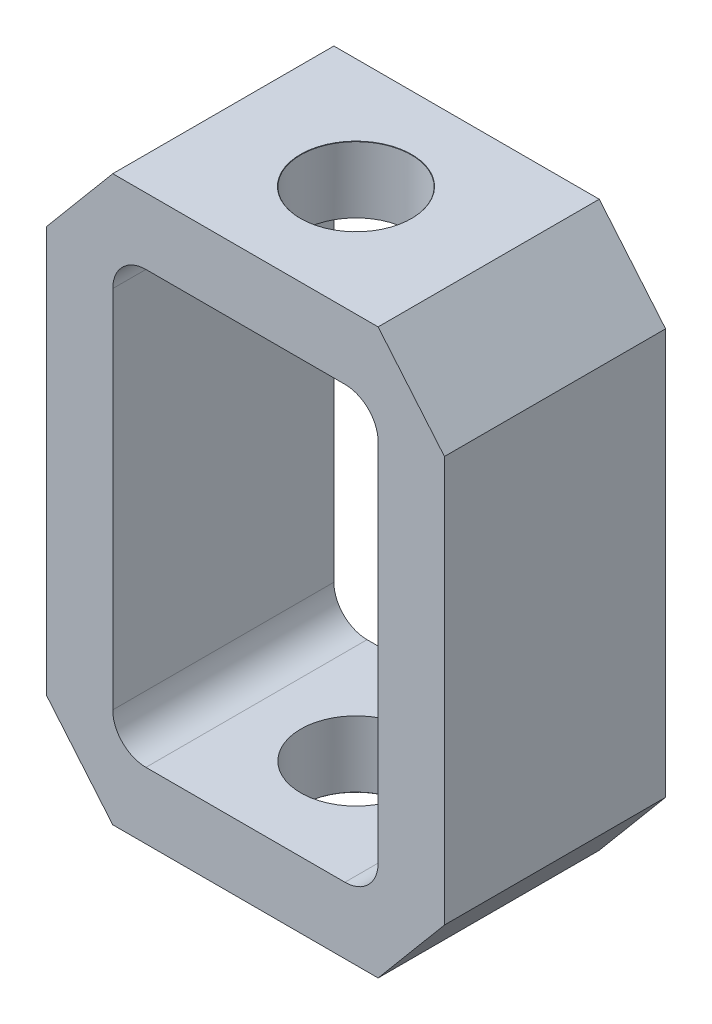
ISO-10303-21;
HEADER;
FILE_DESCRIPTION(('STEP AP214'),'2;1');
FILE_NAME('part.step','',(''),(''),'','','');
FILE_SCHEMA(('AUTOMOTIVE_DESIGN { 1 0 10303 214 1 1 1 1 }'));
ENDSEC;
DATA;
#1=APPLICATION_CONTEXT('core data for automotive mechanical design processes');
#2=APPLICATION_PROTOCOL_DEFINITION('international standard','automotive_design',2000,#1);
#3=PRODUCT_CONTEXT('',#1,'mechanical');
#4=PRODUCT('Part','Part','',(#3));
#5=PRODUCT_RELATED_PRODUCT_CATEGORY('part','',(#4));
#6=PRODUCT_DEFINITION_FORMATION('','',#4);
#7=PRODUCT_DEFINITION_CONTEXT('part definition',#1,'design');
#8=PRODUCT_DEFINITION('design','',#6,#7);
#9=PRODUCT_DEFINITION_SHAPE('','',#8);
#10=(LENGTH_UNIT() NAMED_UNIT(*) SI_UNIT(.MILLI.,.METRE.));
#11=(NAMED_UNIT(*) PLANE_ANGLE_UNIT() SI_UNIT($,.RADIAN.));
#12=(NAMED_UNIT(*) SI_UNIT($,.STERADIAN.) SOLID_ANGLE_UNIT());
#13=UNCERTAINTY_MEASURE_WITH_UNIT(LENGTH_MEASURE(1.E-05),#10,'distance_accuracy_value','');
#14=(GEOMETRIC_REPRESENTATION_CONTEXT(3) GLOBAL_UNCERTAINTY_ASSIGNED_CONTEXT((#13)) GLOBAL_UNIT_ASSIGNED_CONTEXT((#10,
#11,#12)) REPRESENTATION_CONTEXT('',''));
#15=CARTESIAN_POINT('',(0.,0.,0.));
#16=DIRECTION('',(0.,0.,1.));
#17=DIRECTION('',(1.,0.,0.));
#18=AXIS2_PLACEMENT_3D('',#15,#16,#17);
#19=CARTESIAN_POINT('',(-18.,0.,10.));
#20=DIRECTION('',(-1.,0.,0.));
#21=DIRECTION('',(0.,-1.,0.));
#22=AXIS2_PLACEMENT_3D('',#19,#20,#21);
#23=PLANE('',#22);
#24=DIRECTION('',(0.,1.,0.));
#25=VECTOR('',#24,1.);
#26=CARTESIAN_POINT('',(-18.,0.,-10.));
#27=LINE('',#26,#25);
#28=CARTESIAN_POINT('',(-18.,-18.3494784444348,-10.));
#29=VERTEX_POINT('',#28);
#30=CARTESIAN_POINT('',(-18.,18.3494784444348,-10.));
#31=VERTEX_POINT('',#30);
#32=EDGE_CURVE('E162',#29,#31,#27,.T.);
#33=ORIENTED_EDGE('',*,*,#32,.F.);
#34=DIRECTION('',(0.,0.,-1.));
#35=VECTOR('',#34,1.);
#36=CARTESIAN_POINT('',(-18.,-18.3494784444348,10.));
#37=LINE('',#36,#35);
#38=CARTESIAN_POINT('',(-18.,-18.3494784444348,10.));
#39=VERTEX_POINT('',#38);
#40=EDGE_CURVE('E156',#39,#29,#37,.T.);
#41=ORIENTED_EDGE('',*,*,#40,.F.);
#42=DIRECTION('',(0.,1.,0.));
#43=VECTOR('',#42,1.);
#44=CARTESIAN_POINT('',(-18.,0.,10.));
#45=LINE('',#44,#43);
#46=CARTESIAN_POINT('',(-18.,18.3494784444348,10.));
#47=VERTEX_POINT('',#46);
#48=EDGE_CURVE('E159',#39,#47,#45,.T.);
#49=ORIENTED_EDGE('',*,*,#48,.T.);
#50=DIRECTION('',(0.,0.,-1.));
#51=VECTOR('',#50,1.);
#52=CARTESIAN_POINT('',(-18.,18.3494784444348,10.));
#53=LINE('',#52,#51);
#54=EDGE_CURVE('E211',#47,#31,#53,.T.);
#55=ORIENTED_EDGE('',*,*,#54,.T.);
#56=EDGE_LOOP('',(#33,#41,#49,#55));
#57=FACE_BOUND('',#56,.T.);
#58=ADVANCED_FACE('F41',(#57),#23,.T.);
#59=CARTESIAN_POINT('',(-19.5981879169072,-16.4448322528199,10.));
#60=DIRECTION('',(0.766044443118977,0.642787609686541,0.));
#61=DIRECTION('',(-0.642787609686541,0.766044443118977,0.));
#62=AXIS2_PLACEMENT_3D('',#59,#60,#61);
#63=PLANE('',#62);
#64=DIRECTION('',(0.642787609686541,-0.766044443118977,0.));
#65=VECTOR('',#64,1.);
#66=CARTESIAN_POINT('',(-19.5981879169072,-16.4448322528199,-10.));
#67=LINE('',#66,#65);
#68=CARTESIAN_POINT('',(-12.,-25.5,-10.));
#69=VERTEX_POINT('',#68);
#70=EDGE_CURVE('E230',#29,#69,#67,.T.);
#71=ORIENTED_EDGE('',*,*,#70,.T.);
#72=DIRECTION('',(0.,0.,-1.));
#73=VECTOR('',#72,1.);
#74=CARTESIAN_POINT('',(-12.,-25.5,10.));
#75=LINE('',#74,#73);
#76=CARTESIAN_POINT('',(-12.,-25.5,10.));
#77=VERTEX_POINT('',#76);
#78=EDGE_CURVE('E168',#77,#69,#75,.T.);
#79=ORIENTED_EDGE('',*,*,#78,.F.);
#80=DIRECTION('',(0.642787609686541,-0.766044443118977,0.));
#81=VECTOR('',#80,1.);
#82=CARTESIAN_POINT('',(-19.5981879169072,-16.4448322528199,10.));
#83=LINE('',#82,#81);
#84=EDGE_CURVE('E172',#39,#77,#83,.T.);
#85=ORIENTED_EDGE('',*,*,#84,.F.);
#86=ORIENTED_EDGE('',*,*,#40,.T.);
#87=EDGE_LOOP('',(#71,#79,#85,#86));
#88=FACE_BOUND('',#87,.T.);
#89=ADVANCED_FACE('F173',(#88),#63,.F.);
#90=CARTESIAN_POINT('',(0.,-25.5,10.));
#91=DIRECTION('',(0.,1.,0.));
#92=DIRECTION('',(-1.,0.,0.));
#93=AXIS2_PLACEMENT_3D('',#90,#91,#92);
#94=PLANE('',#93);
#95=CARTESIAN_POINT('',(0.,-25.5,0.));
#96=DIRECTION('',(0.,-1.,0.));
#97=DIRECTION('',(0.,0.,-1.));
#98=AXIS2_PLACEMENT_3D('',#95,#96,#97);
#99=CIRCLE('',#98,5.025);
#100=CARTESIAN_POINT('',(0.,-25.5,-5.025));
#101=VERTEX_POINT('',#100);
#102=EDGE_CURVE('E373',#101,#101,#99,.T.);
#103=ORIENTED_EDGE('',*,*,#102,.F.);
#104=EDGE_LOOP('',(#103));
#105=FACE_BOUND('',#104,.T.);
#106=DIRECTION('',(1.,0.,0.));
#107=VECTOR('',#106,1.);
#108=CARTESIAN_POINT('',(0.,-25.5,-10.));
#109=LINE('',#108,#107);
#110=CARTESIAN_POINT('',(12.,-25.5,-10.));
#111=VERTEX_POINT('',#110);
#112=EDGE_CURVE('E233',#69,#111,#109,.T.);
#113=ORIENTED_EDGE('',*,*,#112,.T.);
#114=DIRECTION('',(0.,0.,-1.));
#115=VECTOR('',#114,1.);
#116=CARTESIAN_POINT('',(12.,-25.5,10.));
#117=LINE('',#116,#115);
#118=CARTESIAN_POINT('',(12.,-25.5,10.));
#119=VERTEX_POINT('',#118);
#120=EDGE_CURVE('E273',#119,#111,#117,.T.);
#121=ORIENTED_EDGE('',*,*,#120,.F.);
#122=DIRECTION('',(1.,0.,0.));
#123=VECTOR('',#122,1.);
#124=CARTESIAN_POINT('',(0.,-25.5,10.));
#125=LINE('',#124,#123);
#126=EDGE_CURVE('E177',#77,#119,#125,.T.);
#127=ORIENTED_EDGE('',*,*,#126,.F.);
#128=ORIENTED_EDGE('',*,*,#78,.T.);
#129=EDGE_LOOP('',(#113,#121,#127,#128));
#130=FACE_BOUND('',#129,.T.);
#131=ADVANCED_FACE('F380',(#105,#130),#94,.F.);
#132=CARTESIAN_POINT('',(19.5981879169072,-16.4448322528199,10.));
#133=DIRECTION('',(0.766044443118977,-0.642787609686541,0.));
#134=DIRECTION('',(0.642787609686541,0.766044443118977,0.));
#135=AXIS2_PLACEMENT_3D('',#132,#133,#134);
#136=PLANE('',#135);
#137=DIRECTION('',(-0.642787609686541,-0.766044443118977,0.));
#138=VECTOR('',#137,1.);
#139=CARTESIAN_POINT('',(19.5981879169072,-16.4448322528199,-10.));
#140=LINE('',#139,#138);
#141=CARTESIAN_POINT('',(18.,-18.3494784444348,-10.));
#142=VERTEX_POINT('',#141);
#143=EDGE_CURVE('E237',#142,#111,#140,.T.);
#144=ORIENTED_EDGE('',*,*,#143,.F.);
#145=DIRECTION('',(0.,0.,-1.));
#146=VECTOR('',#145,1.);
#147=CARTESIAN_POINT('',(18.,-18.3494784444348,10.));
#148=LINE('',#147,#146);
#149=CARTESIAN_POINT('',(18.,-18.3494784444348,10.));
#150=VERTEX_POINT('',#149);
#151=EDGE_CURVE('E270',#150,#142,#148,.T.);
#152=ORIENTED_EDGE('',*,*,#151,.F.);
#153=DIRECTION('',(-0.642787609686541,-0.766044443118977,0.));
#154=VECTOR('',#153,1.);
#155=CARTESIAN_POINT('',(19.5981879169072,-16.4448322528199,10.));
#156=LINE('',#155,#154);
#157=EDGE_CURVE('E194',#150,#119,#156,.T.);
#158=ORIENTED_EDGE('',*,*,#157,.T.);
#159=ORIENTED_EDGE('',*,*,#120,.T.);
#160=EDGE_LOOP('',(#144,#152,#158,#159));
#161=FACE_BOUND('',#160,.T.);
#162=ADVANCED_FACE('F383',(#161),#136,.T.);
#163=CARTESIAN_POINT('',(18.,0.,10.));
#164=DIRECTION('',(-1.,0.,0.));
#165=DIRECTION('',(0.,0.,1.));
#166=AXIS2_PLACEMENT_3D('',#163,#164,#165);
#167=PLANE('',#166);
#168=DIRECTION('',(0.,1.,0.));
#169=VECTOR('',#168,1.);
#170=CARTESIAN_POINT('',(18.,0.,-10.));
#171=LINE('',#170,#169);
#172=CARTESIAN_POINT('',(18.,18.3494784444348,-10.));
#173=VERTEX_POINT('',#172);
#174=EDGE_CURVE('E241',#142,#173,#171,.T.);
#175=ORIENTED_EDGE('',*,*,#174,.T.);
#176=DIRECTION('',(0.,0.,-1.));
#177=VECTOR('',#176,1.);
#178=CARTESIAN_POINT('',(18.,18.3494784444348,10.));
#179=LINE('',#178,#177);
#180=CARTESIAN_POINT('',(18.,18.3494784444348,10.));
#181=VERTEX_POINT('',#180);
#182=EDGE_CURVE('E266',#181,#173,#179,.T.);
#183=ORIENTED_EDGE('',*,*,#182,.F.);
#184=DIRECTION('',(0.,1.,0.));
#185=VECTOR('',#184,1.);
#186=CARTESIAN_POINT('',(18.,0.,10.));
#187=LINE('',#186,#185);
#188=EDGE_CURVE('E198',#150,#181,#187,.T.);
#189=ORIENTED_EDGE('',*,*,#188,.F.);
#190=ORIENTED_EDGE('',*,*,#151,.T.);
#191=EDGE_LOOP('',(#175,#183,#189,#190));
#192=FACE_BOUND('',#191,.T.);
#193=ADVANCED_FACE('F394',(#192),#167,.F.);
#194=CARTESIAN_POINT('',(19.5981879169072,16.4448322528199,10.));
#195=DIRECTION('',(-0.766044443118977,-0.642787609686541,0.));
#196=DIRECTION('',(0.642787609686541,-0.766044443118977,0.));
#197=AXIS2_PLACEMENT_3D('',#194,#195,#196);
#198=PLANE('',#197);
#199=DIRECTION('',(-0.642787609686541,0.766044443118977,0.));
#200=VECTOR('',#199,1.);
#201=CARTESIAN_POINT('',(19.5981879169072,16.4448322528199,-10.));
#202=LINE('',#201,#200);
#203=CARTESIAN_POINT('',(12.,25.5,-10.));
#204=VERTEX_POINT('',#203);
#205=EDGE_CURVE('E245',#173,#204,#202,.T.);
#206=ORIENTED_EDGE('',*,*,#205,.T.);
#207=DIRECTION('',(0.,0.,-1.));
#208=VECTOR('',#207,1.);
#209=CARTESIAN_POINT('',(12.,25.5,10.));
#210=LINE('',#209,#208);
#211=CARTESIAN_POINT('',(12.,25.5,10.));
#212=VERTEX_POINT('',#211);
#213=EDGE_CURVE('E263',#212,#204,#210,.T.);
#214=ORIENTED_EDGE('',*,*,#213,.F.);
#215=DIRECTION('',(-0.642787609686541,0.766044443118977,0.));
#216=VECTOR('',#215,1.);
#217=CARTESIAN_POINT('',(19.5981879169072,16.4448322528199,10.));
#218=LINE('',#217,#216);
#219=EDGE_CURVE('E202',#181,#212,#218,.T.);
#220=ORIENTED_EDGE('',*,*,#219,.F.);
#221=ORIENTED_EDGE('',*,*,#182,.T.);
#222=EDGE_LOOP('',(#206,#214,#220,#221));
#223=FACE_BOUND('',#222,.T.);
#224=ADVANCED_FACE('F396',(#223),#198,.F.);
#225=CARTESIAN_POINT('',(0.,25.5,10.));
#226=DIRECTION('',(0.,1.,0.));
#227=DIRECTION('',(-1.,0.,0.));
#228=AXIS2_PLACEMENT_3D('',#225,#226,#227);
#229=PLANE('',#228);
#230=CARTESIAN_POINT('',(0.,25.5,0.));
#231=DIRECTION('',(0.,1.,0.));
#232=DIRECTION('',(0.,0.,1.));
#233=AXIS2_PLACEMENT_3D('',#230,#231,#232);
#234=CIRCLE('',#233,5.025);
#235=CARTESIAN_POINT('',(0.,25.5,5.025));
#236=VERTEX_POINT('',#235);
#237=EDGE_CURVE('E286',#236,#236,#234,.T.);
#238=ORIENTED_EDGE('',*,*,#237,.F.);
#239=EDGE_LOOP('',(#238));
#240=FACE_BOUND('',#239,.T.);
#241=DIRECTION('',(1.,0.,0.));
#242=VECTOR('',#241,1.);
#243=CARTESIAN_POINT('',(0.,25.5,-10.));
#244=LINE('',#243,#242);
#245=CARTESIAN_POINT('',(-12.,25.5,-10.));
#246=VERTEX_POINT('',#245);
#247=EDGE_CURVE('E249',#246,#204,#244,.T.);
#248=ORIENTED_EDGE('',*,*,#247,.F.);
#249=DIRECTION('',(0.,0.,-1.));
#250=VECTOR('',#249,1.);
#251=CARTESIAN_POINT('',(-12.,25.5,10.));
#252=LINE('',#251,#250);
#253=CARTESIAN_POINT('',(-12.,25.5,10.));
#254=VERTEX_POINT('',#253);
#255=EDGE_CURVE('E260',#254,#246,#252,.T.);
#256=ORIENTED_EDGE('',*,*,#255,.F.);
#257=DIRECTION('',(1.,0.,0.));
#258=VECTOR('',#257,1.);
#259=CARTESIAN_POINT('',(0.,25.5,10.));
#260=LINE('',#259,#258);
#261=EDGE_CURVE('E205',#254,#212,#260,.T.);
#262=ORIENTED_EDGE('',*,*,#261,.T.);
#263=ORIENTED_EDGE('',*,*,#213,.T.);
#264=EDGE_LOOP('',(#248,#256,#262,#263));
#265=FACE_BOUND('',#264,.T.);
#266=ADVANCED_FACE('F399',(#240,#265),#229,.T.);
#267=CARTESIAN_POINT('',(0.,-19.5,10.));
#268=DIRECTION('',(0.,1.,0.));
#269=DIRECTION('',(-1.,0.,0.));
#270=AXIS2_PLACEMENT_3D('',#267,#268,#269);
#271=PLANE('',#270);
#272=CARTESIAN_POINT('',(0.,-19.5,0.));
#273=DIRECTION('',(0.,1.,0.));
#274=DIRECTION('',(-1.,0.,0.));
#275=AXIS2_PLACEMENT_3D('',#272,#273,#274);
#276=CIRCLE('',#275,4.99999999999999);
#277=CARTESIAN_POINT('',(-4.99999999999998,-19.5,0.));
#278=VERTEX_POINT('',#277);
#279=EDGE_CURVE('E282',#278,#278,#276,.T.);
#280=ORIENTED_EDGE('',*,*,#279,.F.);
#281=EDGE_LOOP('',(#280));
#282=FACE_BOUND('',#281,.T.);
#283=DIRECTION('',(1.,0.,0.));
#284=VECTOR('',#283,1.);
#285=CARTESIAN_POINT('',(0.,-19.5,-10.));
#286=LINE('',#285,#284);
#287=CARTESIAN_POINT('',(-9.,-19.5,-10.));
#288=VERTEX_POINT('',#287);
#289=CARTESIAN_POINT('',(9.00000000000001,-19.5,-10.));
#290=VERTEX_POINT('',#289);
#291=EDGE_CURVE('E212',#288,#290,#286,.T.);
#292=ORIENTED_EDGE('',*,*,#291,.F.);
#293=DIRECTION('',(0.,0.,-1.));
#294=VECTOR('',#293,1.);
#295=CARTESIAN_POINT('',(-9.,-19.5,10.));
#296=LINE('',#295,#294);
#297=CARTESIAN_POINT('',(-9.,-19.5,10.));
#298=VERTEX_POINT('',#297);
#299=EDGE_CURVE('E298',#288,#298,#296,.F.);
#300=ORIENTED_EDGE('',*,*,#299,.T.);
#301=DIRECTION('',(1.,0.,0.));
#302=VECTOR('',#301,1.);
#303=CARTESIAN_POINT('',(0.,-19.5,10.));
#304=LINE('',#303,#302);
#305=CARTESIAN_POINT('',(9.00000000000001,-19.5,10.));
#306=VERTEX_POINT('',#305);
#307=EDGE_CURVE('E257',#298,#306,#304,.T.);
#308=ORIENTED_EDGE('',*,*,#307,.T.);
#309=DIRECTION('',(0.,0.,-1.));
#310=VECTOR('',#309,1.);
#311=CARTESIAN_POINT('',(9.00000000000001,-19.5,-10.));
#312=LINE('',#311,#310);
#313=EDGE_CURVE('E294',#306,#290,#312,.T.);
#314=ORIENTED_EDGE('',*,*,#313,.T.);
#315=EDGE_LOOP('',(#292,#300,#308,#314));
#316=FACE_BOUND('',#315,.T.);
#317=ADVANCED_FACE('F355',(#282,#316),#271,.T.);
#318=CARTESIAN_POINT('',(-12.,0.,10.));
#319=DIRECTION('',(-1.,0.,0.));
#320=DIRECTION('',(0.,-1.,0.));
#321=AXIS2_PLACEMENT_3D('',#318,#319,#320);
#322=PLANE('',#321);
#323=DIRECTION('',(0.,1.,0.));
#324=VECTOR('',#323,1.);
#325=CARTESIAN_POINT('',(-12.,0.,10.));
#326=LINE('',#325,#324);
#327=CARTESIAN_POINT('',(-12.,-16.5,10.));
#328=VERTEX_POINT('',#327);
#329=CARTESIAN_POINT('',(-12.,16.5,10.));
#330=VERTEX_POINT('',#329);
#331=EDGE_CURVE('E358',#328,#330,#326,.T.);
#332=ORIENTED_EDGE('',*,*,#331,.F.);
#333=DIRECTION('',(0.,0.,-1.));
#334=VECTOR('',#333,1.);
#335=CARTESIAN_POINT('',(-12.,-16.5,10.));
#336=LINE('',#335,#334);
#337=CARTESIAN_POINT('',(-12.,-16.5,-10.));
#338=VERTEX_POINT('',#337);
#339=EDGE_CURVE('E290',#328,#338,#336,.T.);
#340=ORIENTED_EDGE('',*,*,#339,.T.);
#341=DIRECTION('',(0.,1.,0.));
#342=VECTOR('',#341,1.);
#343=CARTESIAN_POINT('',(-12.,0.,-10.));
#344=LINE('',#343,#342);
#345=CARTESIAN_POINT('',(-12.,16.5,-10.));
#346=VERTEX_POINT('',#345);
#347=EDGE_CURVE('E216',#338,#346,#344,.T.);
#348=ORIENTED_EDGE('',*,*,#347,.T.);
#349=DIRECTION('',(0.,0.,-1.));
#350=VECTOR('',#349,1.);
#351=CARTESIAN_POINT('',(-12.,16.5,10.));
#352=LINE('',#351,#350);
#353=EDGE_CURVE('E167',#346,#330,#352,.F.);
#354=ORIENTED_EDGE('',*,*,#353,.T.);
#355=EDGE_LOOP('',(#332,#340,#348,#354));
#356=FACE_BOUND('',#355,.T.);
#357=ADVANCED_FACE('F422',(#356),#322,.F.);
#358=CARTESIAN_POINT('',(0.,19.5,10.));
#359=DIRECTION('',(0.,1.,0.));
#360=DIRECTION('',(-1.,0.,0.));
#361=AXIS2_PLACEMENT_3D('',#358,#359,#360);
#362=PLANE('',#361);
#363=CARTESIAN_POINT('',(0.,19.5,0.));
#364=DIRECTION('',(0.,1.,0.));
#365=DIRECTION('',(-1.,0.,0.));
#366=AXIS2_PLACEMENT_3D('',#363,#364,#365);
#367=CIRCLE('',#366,4.99999999999999);
#368=CARTESIAN_POINT('',(-4.99999999999999,19.5,0.));
#369=VERTEX_POINT('',#368);
#370=EDGE_CURVE('E217',#369,#369,#367,.T.);
#371=ORIENTED_EDGE('',*,*,#370,.T.);
#372=EDGE_LOOP('',(#371));
#373=FACE_BOUND('',#372,.T.);
#374=DIRECTION('',(1.,0.,0.));
#375=VECTOR('',#374,1.);
#376=CARTESIAN_POINT('',(0.,19.5,10.));
#377=LINE('',#376,#375);
#378=CARTESIAN_POINT('',(-9.00000000000001,19.5,10.));
#379=VERTEX_POINT('',#378);
#380=CARTESIAN_POINT('',(9.00000000000001,19.5,10.));
#381=VERTEX_POINT('',#380);
#382=EDGE_CURVE('E188',#379,#381,#377,.T.);
#383=ORIENTED_EDGE('',*,*,#382,.F.);
#384=DIRECTION('',(0.,0.,-1.));
#385=VECTOR('',#384,1.);
#386=CARTESIAN_POINT('',(-9.00000000000001,19.5,-10.));
#387=LINE('',#386,#385);
#388=CARTESIAN_POINT('',(-9.00000000000001,19.5,-10.));
#389=VERTEX_POINT('',#388);
#390=EDGE_CURVE('E310',#379,#389,#387,.T.);
#391=ORIENTED_EDGE('',*,*,#390,.T.);
#392=DIRECTION('',(1.,0.,0.));
#393=VECTOR('',#392,1.);
#394=CARTESIAN_POINT('',(0.,19.5,-10.));
#395=LINE('',#394,#393);
#396=CARTESIAN_POINT('',(9.00000000000001,19.5,-10.));
#397=VERTEX_POINT('',#396);
#398=EDGE_CURVE('E221',#389,#397,#395,.T.);
#399=ORIENTED_EDGE('',*,*,#398,.T.);
#400=DIRECTION('',(0.,0.,-1.));
#401=VECTOR('',#400,1.);
#402=CARTESIAN_POINT('',(9.00000000000001,19.5,10.));
#403=LINE('',#402,#401);
#404=EDGE_CURVE('E57',#397,#381,#403,.F.);
#405=ORIENTED_EDGE('',*,*,#404,.T.);
#406=EDGE_LOOP('',(#383,#391,#399,#405));
#407=FACE_BOUND('',#406,.T.);
#408=ADVANCED_FACE('F339',(#373,#407),#362,.F.);
#409=CARTESIAN_POINT('',(12.,0.,10.));
#410=DIRECTION('',(-1.,0.,0.));
#411=DIRECTION('',(0.,0.,1.));
#412=AXIS2_PLACEMENT_3D('',#409,#410,#411);
#413=PLANE('',#412);
#414=DIRECTION('',(0.,1.,0.));
#415=VECTOR('',#414,1.);
#416=CARTESIAN_POINT('',(12.,0.,-10.));
#417=LINE('',#416,#415);
#418=CARTESIAN_POINT('',(12.,-16.5,-10.));
#419=VERTEX_POINT('',#418);
#420=CARTESIAN_POINT('',(12.,16.5,-10.));
#421=VERTEX_POINT('',#420);
#422=EDGE_CURVE('E224',#419,#421,#417,.T.);
#423=ORIENTED_EDGE('',*,*,#422,.F.);
#424=DIRECTION('',(0.,0.,-1.));
#425=VECTOR('',#424,1.);
#426=CARTESIAN_POINT('',(12.,-16.5,10.));
#427=LINE('',#426,#425);
#428=CARTESIAN_POINT('',(12.,-16.5,10.));
#429=VERTEX_POINT('',#428);
#430=EDGE_CURVE('E305',#419,#429,#427,.F.);
#431=ORIENTED_EDGE('',*,*,#430,.T.);
#432=DIRECTION('',(0.,1.,0.));
#433=VECTOR('',#432,1.);
#434=CARTESIAN_POINT('',(12.,0.,10.));
#435=LINE('',#434,#433);
#436=CARTESIAN_POINT('',(12.,16.5,10.));
#437=VERTEX_POINT('',#436);
#438=EDGE_CURVE('E184',#429,#437,#435,.T.);
#439=ORIENTED_EDGE('',*,*,#438,.T.);
#440=DIRECTION('',(0.,0.,-1.));
#441=VECTOR('',#440,1.);
#442=CARTESIAN_POINT('',(12.,16.5,10.));
#443=LINE('',#442,#441);
#444=EDGE_CURVE('E301',#437,#421,#443,.T.);
#445=ORIENTED_EDGE('',*,*,#444,.T.);
#446=EDGE_LOOP('',(#423,#431,#439,#445));
#447=FACE_BOUND('',#446,.T.);
#448=ADVANCED_FACE('F346',(#447),#413,.T.);
#449=CARTESIAN_POINT('',(-19.5981879169072,16.4448322528199,10.));
#450=DIRECTION('',(-0.766044443118977,0.642787609686541,0.));
#451=DIRECTION('',(-0.642787609686541,-0.766044443118977,0.));
#452=AXIS2_PLACEMENT_3D('',#449,#450,#451);
#453=PLANE('',#452);
#454=DIRECTION('',(0.642787609686541,0.766044443118977,0.));
#455=VECTOR('',#454,1.);
#456=CARTESIAN_POINT('',(-19.5981879169072,16.4448322528199,-10.));
#457=LINE('',#456,#455);
#458=EDGE_CURVE('E253',#31,#246,#457,.T.);
#459=ORIENTED_EDGE('',*,*,#458,.F.);
#460=ORIENTED_EDGE('',*,*,#54,.F.);
#461=DIRECTION('',(0.642787609686541,0.766044443118977,0.));
#462=VECTOR('',#461,1.);
#463=CARTESIAN_POINT('',(-19.5981879169072,16.4448322528199,10.));
#464=LINE('',#463,#462);
#465=EDGE_CURVE('E182',#47,#254,#464,.T.);
#466=ORIENTED_EDGE('',*,*,#465,.T.);
#467=ORIENTED_EDGE('',*,*,#255,.T.);
#468=EDGE_LOOP('',(#459,#460,#466,#467));
#469=FACE_BOUND('',#468,.T.);
#470=ADVANCED_FACE('F402',(#469),#453,.T.);
#471=CARTESIAN_POINT('',(0.,0.,10.));
#472=DIRECTION('',(0.,0.,1.));
#473=DIRECTION('',(1.,0.,0.));
#474=AXIS2_PLACEMENT_3D('',#471,#472,#473);
#475=PLANE('',#474);
#476=ORIENTED_EDGE('',*,*,#307,.F.);
#477=CARTESIAN_POINT('',(-9.,-16.5,10.));
#478=DIRECTION('',(0.,0.,1.));
#479=DIRECTION('',(1.,0.,0.));
#480=AXIS2_PLACEMENT_3D('',#477,#478,#479);
#481=CIRCLE('',#480,3.);
#482=EDGE_CURVE('E317',#298,#328,#481,.F.);
#483=ORIENTED_EDGE('',*,*,#482,.T.);
#484=ORIENTED_EDGE('',*,*,#331,.T.);
#485=CARTESIAN_POINT('',(-9.00000000000001,16.5,10.));
#486=DIRECTION('',(0.,0.,1.));
#487=DIRECTION('',(1.,0.,0.));
#488=AXIS2_PLACEMENT_3D('',#485,#486,#487);
#489=CIRCLE('',#488,3.);
#490=EDGE_CURVE('E64',#330,#379,#489,.F.);
#491=ORIENTED_EDGE('',*,*,#490,.T.);
#492=ORIENTED_EDGE('',*,*,#382,.T.);
#493=CARTESIAN_POINT('',(9.00000000000001,16.5,10.));
#494=DIRECTION('',(0.,0.,1.));
#495=DIRECTION('',(1.,0.,0.));
#496=AXIS2_PLACEMENT_3D('',#493,#494,#495);
#497=CIRCLE('',#496,3.);
#498=EDGE_CURVE('E11',#381,#437,#497,.F.);
#499=ORIENTED_EDGE('',*,*,#498,.T.);
#500=ORIENTED_EDGE('',*,*,#438,.F.);
#501=CARTESIAN_POINT('',(9.00000000000001,-16.5,10.));
#502=DIRECTION('',(0.,0.,1.));
#503=DIRECTION('',(1.,0.,0.));
#504=AXIS2_PLACEMENT_3D('',#501,#502,#503);
#505=CIRCLE('',#504,3.);
#506=EDGE_CURVE('E323',#429,#306,#505,.F.);
#507=ORIENTED_EDGE('',*,*,#506,.T.);
#508=EDGE_LOOP('',(#476,#483,#484,#491,#492,#499,#500,#507));
#509=FACE_BOUND('',#508,.T.);
#510=ORIENTED_EDGE('',*,*,#48,.F.);
#511=ORIENTED_EDGE('',*,*,#84,.T.);
#512=ORIENTED_EDGE('',*,*,#126,.T.);
#513=ORIENTED_EDGE('',*,*,#157,.F.);
#514=ORIENTED_EDGE('',*,*,#188,.T.);
#515=ORIENTED_EDGE('',*,*,#219,.T.);
#516=ORIENTED_EDGE('',*,*,#261,.F.);
#517=ORIENTED_EDGE('',*,*,#465,.F.);
#518=EDGE_LOOP('',(#510,#511,#512,#513,#514,#515,#516,#517));
#519=FACE_BOUND('',#518,.T.);
#520=ADVANCED_FACE('F179',(#509,#519),#475,.T.);
#521=CARTESIAN_POINT('',(0.,0.,-10.));
#522=DIRECTION('',(0.,0.,1.));
#523=DIRECTION('',(1.,0.,0.));
#524=AXIS2_PLACEMENT_3D('',#521,#522,#523);
#525=PLANE('',#524);
#526=ORIENTED_EDGE('',*,*,#347,.F.);
#527=CARTESIAN_POINT('',(-9.,-16.5,-10.));
#528=DIRECTION('',(0.,0.,1.));
#529=DIRECTION('',(1.,0.,0.));
#530=AXIS2_PLACEMENT_3D('',#527,#528,#529);
#531=CIRCLE('',#530,3.);
#532=EDGE_CURVE('E314',#338,#288,#531,.T.);
#533=ORIENTED_EDGE('',*,*,#532,.T.);
#534=ORIENTED_EDGE('',*,*,#291,.T.);
#535=CARTESIAN_POINT('',(9.00000000000001,-16.5,-10.));
#536=DIRECTION('',(0.,0.,1.));
#537=DIRECTION('',(1.,0.,0.));
#538=AXIS2_PLACEMENT_3D('',#535,#536,#537);
#539=CIRCLE('',#538,3.);
#540=EDGE_CURVE('E320',#290,#419,#539,.T.);
#541=ORIENTED_EDGE('',*,*,#540,.T.);
#542=ORIENTED_EDGE('',*,*,#422,.T.);
#543=CARTESIAN_POINT('',(9.00000000000001,16.5,-10.));
#544=DIRECTION('',(0.,0.,1.));
#545=DIRECTION('',(1.,0.,0.));
#546=AXIS2_PLACEMENT_3D('',#543,#544,#545);
#547=CIRCLE('',#546,3.);
#548=EDGE_CURVE('E50',#421,#397,#547,.T.);
#549=ORIENTED_EDGE('',*,*,#548,.T.);
#550=ORIENTED_EDGE('',*,*,#398,.F.);
#551=CARTESIAN_POINT('',(-9.00000000000001,16.5,-10.));
#552=DIRECTION('',(0.,0.,1.));
#553=DIRECTION('',(1.,0.,0.));
#554=AXIS2_PLACEMENT_3D('',#551,#552,#553);
#555=CIRCLE('',#554,3.);
#556=EDGE_CURVE('E326',#389,#346,#555,.T.);
#557=ORIENTED_EDGE('',*,*,#556,.T.);
#558=EDGE_LOOP('',(#526,#533,#534,#541,#542,#549,#550,#557));
#559=FACE_BOUND('',#558,.T.);
#560=ORIENTED_EDGE('',*,*,#32,.T.);
#561=ORIENTED_EDGE('',*,*,#458,.T.);
#562=ORIENTED_EDGE('',*,*,#247,.T.);
#563=ORIENTED_EDGE('',*,*,#205,.F.);
#564=ORIENTED_EDGE('',*,*,#174,.F.);
#565=ORIENTED_EDGE('',*,*,#143,.T.);
#566=ORIENTED_EDGE('',*,*,#112,.F.);
#567=ORIENTED_EDGE('',*,*,#70,.F.);
#568=EDGE_LOOP('',(#560,#561,#562,#563,#564,#565,#566,#567));
#569=FACE_BOUND('',#568,.T.);
#570=ADVANCED_FACE('F334',(#559,#569),#525,.F.);
#571=CARTESIAN_POINT('',(0.,25.5,0.));
#572=DIRECTION('',(0.,1.,0.));
#573=DIRECTION('',(0.,0.,1.));
#574=AXIS2_PLACEMENT_3D('',#571,#572,#573);
#575=CYLINDRICAL_SURFACE('',#574,4.99999999999999);
#576=CARTESIAN_POINT('',(0.,25.475,0.));
#577=DIRECTION('',(0.,1.,0.));
#578=DIRECTION('',(0.,0.,1.));
#579=AXIS2_PLACEMENT_3D('',#576,#577,#578);
#580=CIRCLE('',#579,5.);
#581=CARTESIAN_POINT('',(0.,25.475,5.));
#582=VERTEX_POINT('',#581);
#583=EDGE_CURVE('E281',#582,#582,#580,.T.);
#584=ORIENTED_EDGE('',*,*,#583,.T.);
#585=EDGE_LOOP('',(#584));
#586=FACE_BOUND('',#585,.T.);
#587=ORIENTED_EDGE('',*,*,#370,.F.);
#588=EDGE_LOOP('',(#587));
#589=FACE_BOUND('',#588,.T.);
#590=ADVANCED_FACE('F473',(#586,#589),#575,.F.);
#591=CARTESIAN_POINT('',(0.,25.5,0.));
#592=DIRECTION('',(0.,1.,0.));
#593=DIRECTION('',(0.,0.,1.));
#594=AXIS2_PLACEMENT_3D('',#591,#592,#593);
#595=CONICAL_SURFACE('',#594,5.025,0.785398163397448);
#596=ORIENTED_EDGE('',*,*,#583,.F.);
#597=EDGE_LOOP('',(#596));
#598=FACE_BOUND('',#597,.T.);
#599=ORIENTED_EDGE('',*,*,#237,.T.);
#600=EDGE_LOOP('',(#599));
#601=FACE_BOUND('',#600,.T.);
#602=ADVANCED_FACE('F524',(#598,#601),#595,.F.);
#603=CARTESIAN_POINT('',(0.,-25.5,0.));
#604=DIRECTION('',(0.,-1.,0.));
#605=DIRECTION('',(0.,0.,-1.));
#606=AXIS2_PLACEMENT_3D('',#603,#604,#605);
#607=CYLINDRICAL_SURFACE('',#606,4.99999999999999);
#608=ORIENTED_EDGE('',*,*,#279,.T.);
#609=EDGE_LOOP('',(#608));
#610=FACE_BOUND('',#609,.T.);
#611=CARTESIAN_POINT('',(0.,-25.475,0.));
#612=DIRECTION('',(0.,-1.,0.));
#613=DIRECTION('',(0.,0.,-1.));
#614=AXIS2_PLACEMENT_3D('',#611,#612,#613);
#615=CIRCLE('',#614,4.99999999999999);
#616=CARTESIAN_POINT('',(0.,-25.475,-4.99999999999999));
#617=VERTEX_POINT('',#616);
#618=EDGE_CURVE('E287',#617,#617,#615,.T.);
#619=ORIENTED_EDGE('',*,*,#618,.T.);
#620=EDGE_LOOP('',(#619));
#621=FACE_BOUND('',#620,.T.);
#622=ADVANCED_FACE('F514',(#610,#621),#607,.F.);
#623=CARTESIAN_POINT('',(0.,-25.5,0.));
#624=DIRECTION('',(0.,-1.,0.));
#625=DIRECTION('',(0.,0.,-1.));
#626=AXIS2_PLACEMENT_3D('',#623,#624,#625);
#627=CONICAL_SURFACE('',#626,5.025,0.785398163397431);
#628=ORIENTED_EDGE('',*,*,#618,.F.);
#629=EDGE_LOOP('',(#628));
#630=FACE_BOUND('',#629,.T.);
#631=ORIENTED_EDGE('',*,*,#102,.T.);
#632=EDGE_LOOP('',(#631));
#633=FACE_BOUND('',#632,.T.);
#634=ADVANCED_FACE('F378',(#630,#633),#627,.F.);
#635=CARTESIAN_POINT('',(-9.,-16.5,10.));
#636=DIRECTION('',(0.,0.,-1.));
#637=DIRECTION('',(-1.,0.,0.));
#638=AXIS2_PLACEMENT_3D('',#635,#636,#637);
#639=CYLINDRICAL_SURFACE('',#638,3.);
#640=ORIENTED_EDGE('',*,*,#482,.F.);
#641=ORIENTED_EDGE('',*,*,#299,.F.);
#642=ORIENTED_EDGE('',*,*,#532,.F.);
#643=ORIENTED_EDGE('',*,*,#339,.F.);
#644=EDGE_LOOP('',(#640,#641,#642,#643));
#645=FACE_BOUND('',#644,.T.);
#646=ADVANCED_FACE('F430',(#645),#639,.F.);
#647=CARTESIAN_POINT('',(9.00000000000001,-16.5,10.));
#648=DIRECTION('',(0.,0.,1.));
#649=DIRECTION('',(1.,0.,0.));
#650=AXIS2_PLACEMENT_3D('',#647,#648,#649);
#651=CYLINDRICAL_SURFACE('',#650,3.);
#652=ORIENTED_EDGE('',*,*,#506,.F.);
#653=ORIENTED_EDGE('',*,*,#430,.F.);
#654=ORIENTED_EDGE('',*,*,#540,.F.);
#655=ORIENTED_EDGE('',*,*,#313,.F.);
#656=EDGE_LOOP('',(#652,#653,#654,#655));
#657=FACE_BOUND('',#656,.T.);
#658=ADVANCED_FACE('F349',(#657),#651,.F.);
#659=CARTESIAN_POINT('',(-9.00000000000001,16.5,10.));
#660=DIRECTION('',(0.,0.,1.));
#661=DIRECTION('',(1.,0.,0.));
#662=AXIS2_PLACEMENT_3D('',#659,#660,#661);
#663=CYLINDRICAL_SURFACE('',#662,3.);
#664=ORIENTED_EDGE('',*,*,#490,.F.);
#665=ORIENTED_EDGE('',*,*,#353,.F.);
#666=ORIENTED_EDGE('',*,*,#556,.F.);
#667=ORIENTED_EDGE('',*,*,#390,.F.);
#668=EDGE_LOOP('',(#664,#665,#666,#667));
#669=FACE_BOUND('',#668,.T.);
#670=ADVANCED_FACE('F435',(#669),#663,.F.);
#671=CARTESIAN_POINT('',(9.00000000000001,16.5,10.));
#672=DIRECTION('',(0.,0.,-1.));
#673=DIRECTION('',(-1.,0.,0.));
#674=AXIS2_PLACEMENT_3D('',#671,#672,#673);
#675=CYLINDRICAL_SURFACE('',#674,3.);
#676=ORIENTED_EDGE('',*,*,#498,.F.);
#677=ORIENTED_EDGE('',*,*,#404,.F.);
#678=ORIENTED_EDGE('',*,*,#548,.F.);
#679=ORIENTED_EDGE('',*,*,#444,.F.);
#680=EDGE_LOOP('',(#676,#677,#678,#679));
#681=FACE_BOUND('',#680,.T.);
#682=ADVANCED_FACE('F43',(#681),#675,.F.);
#683=CLOSED_SHELL('',(#58,#89,#131,#162,#193,#224,#266,#317,#357,#408,#448,#470,#520,#570,#590,
#602,#622,#634,#646,#658,#670,#682));
#684=MANIFOLD_SOLID_BREP('B2',#683);
#685=ADVANCED_BREP_SHAPE_REPRESENTATION('',(#18,#684),#14);
#686=SHAPE_DEFINITION_REPRESENTATION(#9,#685);
ENDSEC;
END-ISO-10303-21;
